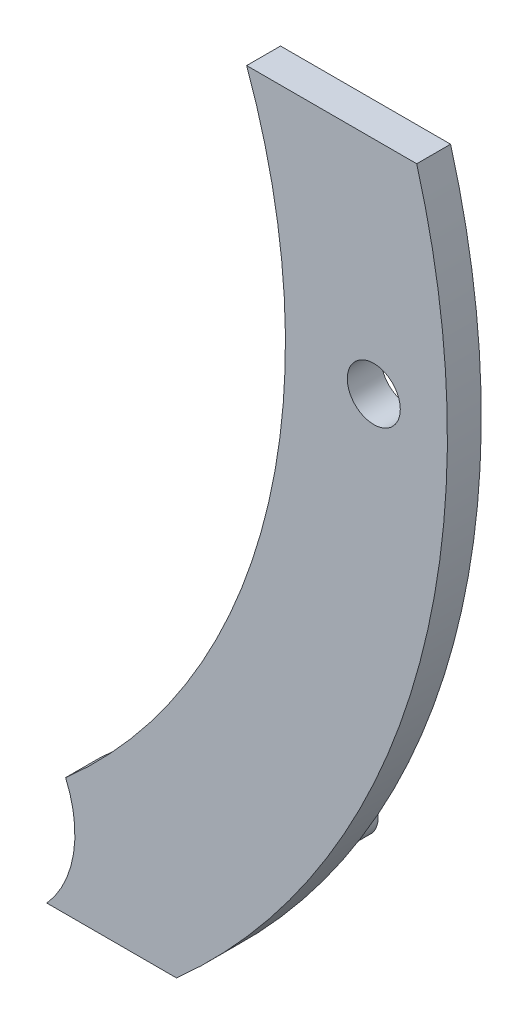
ISO-10303-21;
HEADER;
FILE_DESCRIPTION(('STEP AP214'),'2;1');
FILE_NAME('part.step','',(''),(''),'','','');
FILE_SCHEMA(('AUTOMOTIVE_DESIGN { 1 0 10303 214 1 1 1 1 }'));
ENDSEC;
DATA;
#1=APPLICATION_CONTEXT('core data for automotive mechanical design processes');
#2=APPLICATION_PROTOCOL_DEFINITION('international standard','automotive_design',2000,#1);
#3=PRODUCT_CONTEXT('',#1,'mechanical');
#4=PRODUCT('Part','Part','',(#3));
#5=PRODUCT_RELATED_PRODUCT_CATEGORY('part','',(#4));
#6=PRODUCT_DEFINITION_FORMATION('','',#4);
#7=PRODUCT_DEFINITION_CONTEXT('part definition',#1,'design');
#8=PRODUCT_DEFINITION('design','',#6,#7);
#9=PRODUCT_DEFINITION_SHAPE('','',#8);
#10=(LENGTH_UNIT() NAMED_UNIT(*) SI_UNIT(.MILLI.,.METRE.));
#11=(NAMED_UNIT(*) PLANE_ANGLE_UNIT() SI_UNIT($,.RADIAN.));
#12=(NAMED_UNIT(*) SI_UNIT($,.STERADIAN.) SOLID_ANGLE_UNIT());
#13=UNCERTAINTY_MEASURE_WITH_UNIT(LENGTH_MEASURE(1.E-05),#10,'distance_accuracy_value','');
#14=(GEOMETRIC_REPRESENTATION_CONTEXT(3) GLOBAL_UNCERTAINTY_ASSIGNED_CONTEXT((#13)) GLOBAL_UNIT_ASSIGNED_CONTEXT((#10,
#11,#12)) REPRESENTATION_CONTEXT('',''));
#15=CARTESIAN_POINT('',(0.,0.,0.));
#16=DIRECTION('',(0.,0.,1.));
#17=DIRECTION('',(1.,0.,0.));
#18=AXIS2_PLACEMENT_3D('',#15,#16,#17);
#19=CARTESIAN_POINT('',(0.,0.,3.175));
#20=DIRECTION('',(0.,0.,-1.));
#21=DIRECTION('',(-1.,0.,0.));
#22=AXIS2_PLACEMENT_3D('',#19,#20,#21);
#23=CYLINDRICAL_SURFACE('',#22,54.9999999429532);
#24=CARTESIAN_POINT('',(0.,0.,3.175));
#25=DIRECTION('',(0.,0.,1.));
#26=DIRECTION('',(1.,0.,0.));
#27=AXIS2_PLACEMENT_3D('',#24,#25,#26);
#28=CIRCLE('',#27,55.);
#29=CARTESIAN_POINT('',(36.6046103273952,-41.0499999574228,3.175));
#30=VERTEX_POINT('',#29);
#31=CARTESIAN_POINT('',(52.9150262212918,15.,3.175));
#32=VERTEX_POINT('',#31);
#33=EDGE_CURVE('E192',#30,#32,#28,.T.);
#34=ORIENTED_EDGE('',*,*,#33,.T.);
#35=DIRECTION('',(0.,0.,-1.));
#36=VECTOR('',#35,1.);
#37=CARTESIAN_POINT('',(52.9150262212918,15.,5.475));
#38=LINE('',#37,#36);
#39=CARTESIAN_POINT('',(52.9150262212918,15.,5.475));
#40=VERTEX_POINT('',#39);
#41=EDGE_CURVE('E209',#40,#32,#38,.T.);
#42=ORIENTED_EDGE('',*,*,#41,.F.);
#43=CARTESIAN_POINT('',(0.,0.,5.475));
#44=DIRECTION('',(0.,0.,1.));
#45=DIRECTION('',(1.,0.,0.));
#46=AXIS2_PLACEMENT_3D('',#43,#44,#45);
#47=CIRCLE('',#46,55.);
#48=CARTESIAN_POINT('',(36.604610365362,-41.0500000000004,5.475));
#49=VERTEX_POINT('',#48);
#50=EDGE_CURVE('E172',#49,#40,#47,.T.);
#51=ORIENTED_EDGE('',*,*,#50,.F.);
#52=DIRECTION('',(0.,0.,-1.));
#53=VECTOR('',#52,1.);
#54=CARTESIAN_POINT('',(36.604610365362,-41.0500000000004,5.475));
#55=LINE('',#54,#53);
#56=EDGE_CURVE('E213',#49,#30,#55,.T.);
#57=ORIENTED_EDGE('',*,*,#56,.T.);
#58=EDGE_LOOP('',(#34,#42,#51,#57));
#59=FACE_BOUND('',#58,.T.);
#60=ADVANCED_FACE('F41',(#59),#23,.T.);
#61=CARTESIAN_POINT('',(50.,-3.49148133884313E-13,3.175));
#62=DIRECTION('',(0.,0.,-1.));
#63=DIRECTION('',(-1.,0.,0.));
#64=AXIS2_PLACEMENT_3D('',#61,#62,#63);
#65=CYLINDRICAL_SURFACE('',#64,1.8);
#66=CARTESIAN_POINT('',(50.,-3.49148133884313E-13,3.175));
#67=DIRECTION('',(0.,0.,1.));
#68=DIRECTION('',(1.,0.,0.));
#69=AXIS2_PLACEMENT_3D('',#66,#67,#68);
#70=CIRCLE('',#69,1.8);
#71=CARTESIAN_POINT('',(51.8,-3.49148133884313E-13,3.175));
#72=VERTEX_POINT('',#71);
#73=EDGE_CURVE('E156',#72,#72,#70,.T.);
#74=ORIENTED_EDGE('',*,*,#73,.F.);
#75=EDGE_LOOP('',(#74));
#76=FACE_BOUND('',#75,.T.);
#77=CARTESIAN_POINT('',(50.,-3.49148133884313E-13,5.475));
#78=DIRECTION('',(0.,0.,1.));
#79=DIRECTION('',(1.,0.,0.));
#80=AXIS2_PLACEMENT_3D('',#77,#78,#79);
#81=CIRCLE('',#80,1.8);
#82=CARTESIAN_POINT('',(51.8,-3.49148133884313E-13,5.475));
#83=VERTEX_POINT('',#82);
#84=EDGE_CURVE('E160',#83,#83,#81,.T.);
#85=ORIENTED_EDGE('',*,*,#84,.T.);
#86=EDGE_LOOP('',(#85));
#87=FACE_BOUND('',#86,.T.);
#88=ADVANCED_FACE('F310',(#76,#87),#65,.F.);
#89=CARTESIAN_POINT('',(22.2,-36.0500000000004,5.475));
#90=DIRECTION('',(0.,0.,1.));
#91=DIRECTION('',(1.,0.,0.));
#92=AXIS2_PLACEMENT_3D('',#89,#90,#91);
#93=PLANE('',#92);
#94=CARTESIAN_POINT('',(22.2,-36.0500000000004,5.475));
#95=DIRECTION('',(0.,0.,-1.));
#96=DIRECTION('',(1.,0.,0.));
#97=AXIS2_PLACEMENT_3D('',#94,#95,#96);
#98=CIRCLE('',#97,7.50000000000001);
#99=CARTESIAN_POINT('',(29.0662473279325,-33.0326091350874,5.475));
#100=VERTEX_POINT('',#99);
#101=CARTESIAN_POINT('',(27.7901699437495,-41.0500000000004,5.475));
#102=VERTEX_POINT('',#101);
#103=EDGE_CURVE('E165',#100,#102,#98,.T.);
#104=ORIENTED_EDGE('',*,*,#103,.T.);
#105=DIRECTION('',(1.,0.,0.));
#106=VECTOR('',#105,1.);
#107=CARTESIAN_POINT('',(27.7901699437495,-41.0500000000004,5.475));
#108=LINE('',#107,#106);
#109=EDGE_CURVE('E168',#102,#49,#108,.T.);
#110=ORIENTED_EDGE('',*,*,#109,.T.);
#111=ORIENTED_EDGE('',*,*,#50,.T.);
#112=DIRECTION('',(-1.,0.,0.));
#113=VECTOR('',#112,1.);
#114=CARTESIAN_POINT('',(41.3642357598929,15.,5.475));
#115=LINE('',#114,#113);
#116=CARTESIAN_POINT('',(41.3642357598929,15.,5.475));
#117=VERTEX_POINT('',#116);
#118=EDGE_CURVE('E175',#40,#117,#115,.T.);
#119=ORIENTED_EDGE('',*,*,#118,.T.);
#120=CARTESIAN_POINT('',(0.,0.,5.475));
#121=DIRECTION('',(0.,0.,-1.));
#122=DIRECTION('',(1.,0.,0.));
#123=AXIS2_PLACEMENT_3D('',#120,#121,#122);
#124=CIRCLE('',#123,44.);
#125=EDGE_CURVE('E178',#117,#100,#124,.T.);
#126=ORIENTED_EDGE('',*,*,#125,.T.);
#127=EDGE_LOOP('',(#104,#110,#111,#119,#126));
#128=FACE_BOUND('',#127,.T.);
#129=ORIENTED_EDGE('',*,*,#84,.F.);
#130=EDGE_LOOP('',(#129));
#131=FACE_BOUND('',#130,.T.);
#132=ADVANCED_FACE('F315',(#128,#131),#93,.T.);
#133=CARTESIAN_POINT('',(22.2,-36.0500000000004,5.475));
#134=DIRECTION('',(0.,0.,-1.));
#135=DIRECTION('',(-1.,0.,0.));
#136=AXIS2_PLACEMENT_3D('',#133,#134,#135);
#137=CYLINDRICAL_SURFACE('',#136,7.50000000000001);
#138=DIRECTION('',(0.,0.,-1.));
#139=VECTOR('',#138,1.);
#140=CARTESIAN_POINT('',(29.4929760729074,-34.3000000000002,5.475));
#141=LINE('',#140,#139);
#142=CARTESIAN_POINT('',(29.4929760729074,-34.3000000000002,3.175));
#143=VERTEX_POINT('',#142);
#144=CARTESIAN_POINT('',(29.4929760729074,-34.3000000000002,-5.825));
#145=VERTEX_POINT('',#144);
#146=EDGE_CURVE('E140',#143,#145,#141,.T.);
#147=ORIENTED_EDGE('',*,*,#146,.T.);
#148=CARTESIAN_POINT('',(22.2,-36.0500000000004,-5.825));
#149=DIRECTION('',(0.,0.,-1.));
#150=DIRECTION('',(-1.,0.,0.));
#151=AXIS2_PLACEMENT_3D('',#148,#149,#150);
#152=CIRCLE('',#151,7.50000000000001);
#153=CARTESIAN_POINT('',(29.4929760729074,-37.8000000000004,-5.825));
#154=VERTEX_POINT('',#153);
#155=EDGE_CURVE('E11',#145,#154,#152,.T.);
#156=ORIENTED_EDGE('',*,*,#155,.T.);
#157=DIRECTION('',(0.,0.,-1.));
#158=VECTOR('',#157,1.);
#159=CARTESIAN_POINT('',(29.4929760729074,-37.8000000000004,5.475));
#160=LINE('',#159,#158);
#161=CARTESIAN_POINT('',(29.4929760729074,-37.8000000000004,3.175));
#162=VERTEX_POINT('',#161);
#163=EDGE_CURVE('E142',#162,#154,#160,.T.);
#164=ORIENTED_EDGE('',*,*,#163,.F.);
#165=CARTESIAN_POINT('',(22.2,-36.0500000000004,3.175));
#166=DIRECTION('',(0.,0.,-1.));
#167=DIRECTION('',(1.,0.,0.));
#168=AXIS2_PLACEMENT_3D('',#165,#166,#167);
#169=CIRCLE('',#168,7.5);
#170=CARTESIAN_POINT('',(27.7901699437495,-41.0500000000004,3.175));
#171=VERTEX_POINT('',#170);
#172=EDGE_CURVE('E184',#162,#171,#169,.T.);
#173=ORIENTED_EDGE('',*,*,#172,.T.);
#174=DIRECTION('',(0.,0.,-1.));
#175=VECTOR('',#174,1.);
#176=CARTESIAN_POINT('',(27.7901699437495,-41.0500000000004,5.475));
#177=LINE('',#176,#175);
#178=EDGE_CURVE('E217',#102,#171,#177,.T.);
#179=ORIENTED_EDGE('',*,*,#178,.F.);
#180=ORIENTED_EDGE('',*,*,#103,.F.);
#181=DIRECTION('',(0.,0.,-1.));
#182=VECTOR('',#181,1.);
#183=CARTESIAN_POINT('',(29.0662473279325,-33.0326091350874,5.475));
#184=LINE('',#183,#182);
#185=CARTESIAN_POINT('',(29.0662473279325,-33.0326091350874,3.175));
#186=VERTEX_POINT('',#185);
#187=EDGE_CURVE('E181',#100,#186,#184,.T.);
#188=ORIENTED_EDGE('',*,*,#187,.T.);
#189=CARTESIAN_POINT('',(22.2,-36.0500000000004,3.175));
#190=DIRECTION('',(0.,0.,-1.));
#191=DIRECTION('',(1.,0.,0.));
#192=AXIS2_PLACEMENT_3D('',#189,#190,#191);
#193=CIRCLE('',#192,7.50000000000001);
#194=EDGE_CURVE('E164',#186,#143,#193,.T.);
#195=ORIENTED_EDGE('',*,*,#194,.T.);
#196=EDGE_LOOP('',(#147,#156,#164,#173,#179,#180,#188,#195));
#197=FACE_BOUND('',#196,.T.);
#198=ADVANCED_FACE('F298',(#197),#137,.F.);
#199=CARTESIAN_POINT('',(27.7901699437495,-41.0500000000004,5.475));
#200=DIRECTION('',(0.,1.,0.));
#201=DIRECTION('',(0.,0.,1.));
#202=AXIS2_PLACEMENT_3D('',#199,#200,#201);
#203=PLANE('',#202);
#204=DIRECTION('',(1.,0.,0.));
#205=VECTOR('',#204,1.);
#206=CARTESIAN_POINT('',(27.7901699437495,-41.0500000000004,3.175));
#207=LINE('',#206,#205);
#208=EDGE_CURVE('E188',#171,#30,#207,.T.);
#209=ORIENTED_EDGE('',*,*,#208,.T.);
#210=ORIENTED_EDGE('',*,*,#56,.F.);
#211=ORIENTED_EDGE('',*,*,#109,.F.);
#212=ORIENTED_EDGE('',*,*,#178,.T.);
#213=EDGE_LOOP('',(#209,#210,#211,#212));
#214=FACE_BOUND('',#213,.T.);
#215=ADVANCED_FACE('F321',(#214),#203,.F.);
#216=CARTESIAN_POINT('',(41.3642357598929,15.,5.475));
#217=DIRECTION('',(0.,-1.,0.));
#218=DIRECTION('',(0.,0.,-1.));
#219=AXIS2_PLACEMENT_3D('',#216,#217,#218);
#220=PLANE('',#219);
#221=DIRECTION('',(-1.,0.,0.));
#222=VECTOR('',#221,1.);
#223=CARTESIAN_POINT('',(41.3642357598929,15.,3.175));
#224=LINE('',#223,#222);
#225=CARTESIAN_POINT('',(41.3642357598929,15.,3.175));
#226=VERTEX_POINT('',#225);
#227=EDGE_CURVE('E195',#32,#226,#224,.T.);
#228=ORIENTED_EDGE('',*,*,#227,.T.);
#229=DIRECTION('',(0.,0.,-1.));
#230=VECTOR('',#229,1.);
#231=CARTESIAN_POINT('',(41.3642357598929,15.,5.475));
#232=LINE('',#231,#230);
#233=EDGE_CURVE('E205',#117,#226,#232,.T.);
#234=ORIENTED_EDGE('',*,*,#233,.F.);
#235=ORIENTED_EDGE('',*,*,#118,.F.);
#236=ORIENTED_EDGE('',*,*,#41,.T.);
#237=EDGE_LOOP('',(#228,#234,#235,#236));
#238=FACE_BOUND('',#237,.T.);
#239=ADVANCED_FACE('F324',(#238),#220,.F.);
#240=CARTESIAN_POINT('',(0.,0.,5.475));
#241=DIRECTION('',(0.,0.,-1.));
#242=DIRECTION('',(-1.,0.,0.));
#243=AXIS2_PLACEMENT_3D('',#240,#241,#242);
#244=CYLINDRICAL_SURFACE('',#243,44.);
#245=CARTESIAN_POINT('',(0.,0.,3.175));
#246=DIRECTION('',(0.,0.,-1.));
#247=DIRECTION('',(1.,0.,0.));
#248=AXIS2_PLACEMENT_3D('',#245,#246,#247);
#249=CIRCLE('',#248,44.);
#250=EDGE_CURVE('E169',#226,#186,#249,.T.);
#251=ORIENTED_EDGE('',*,*,#250,.T.);
#252=ORIENTED_EDGE('',*,*,#187,.F.);
#253=ORIENTED_EDGE('',*,*,#125,.F.);
#254=ORIENTED_EDGE('',*,*,#233,.T.);
#255=EDGE_LOOP('',(#251,#252,#253,#254));
#256=FACE_BOUND('',#255,.T.);
#257=ADVANCED_FACE('F328',(#256),#244,.F.);
#258=CARTESIAN_POINT('',(83.2287442039231,-87.499999988792,3.175));
#259=DIRECTION('',(0.,0.,1.));
#260=DIRECTION('',(1.,0.,0.));
#261=AXIS2_PLACEMENT_3D('',#258,#259,#260);
#262=PLANE('',#261);
#263=ORIENTED_EDGE('',*,*,#73,.T.);
#264=EDGE_LOOP('',(#263));
#265=FACE_BOUND('',#264,.T.);
#266=CARTESIAN_POINT('',(37.25,-36.0500000000002,3.175));
#267=DIRECTION('',(0.,0.,1.));
#268=DIRECTION('',(1.,0.,0.));
#269=AXIS2_PLACEMENT_3D('',#266,#267,#268);
#270=CIRCLE('',#269,1.75);
#271=CARTESIAN_POINT('',(37.25,-34.3000000000002,3.175));
#272=VERTEX_POINT('',#271);
#273=CARTESIAN_POINT('',(37.25,-37.8000000000002,3.175));
#274=VERTEX_POINT('',#273);
#275=EDGE_CURVE('E128',#272,#274,#270,.F.);
#276=ORIENTED_EDGE('',*,*,#275,.F.);
#277=DIRECTION('',(1.,0.,0.));
#278=VECTOR('',#277,1.);
#279=CARTESIAN_POINT('',(21.0000000000007,-34.3000000000002,3.175));
#280=LINE('',#279,#278);
#281=EDGE_CURVE('E131',#143,#272,#280,.T.);
#282=ORIENTED_EDGE('',*,*,#281,.F.);
#283=ORIENTED_EDGE('',*,*,#194,.F.);
#284=ORIENTED_EDGE('',*,*,#250,.F.);
#285=ORIENTED_EDGE('',*,*,#227,.F.);
#286=ORIENTED_EDGE('',*,*,#33,.F.);
#287=ORIENTED_EDGE('',*,*,#208,.F.);
#288=ORIENTED_EDGE('',*,*,#172,.F.);
#289=DIRECTION('',(-1.,0.,0.));
#290=VECTOR('',#289,1.);
#291=CARTESIAN_POINT('',(21.0000000000007,-37.8000000000004,3.175));
#292=LINE('',#291,#290);
#293=EDGE_CURVE('E134',#274,#162,#292,.T.);
#294=ORIENTED_EDGE('',*,*,#293,.F.);
#295=EDGE_LOOP('',(#276,#282,#283,#284,#285,#286,#287,#288,#294));
#296=FACE_BOUND('',#295,.T.);
#297=ADVANCED_FACE('F130',(#265,#296),#262,.F.);
#298=CARTESIAN_POINT('',(29.4929760729074,-37.8000000000004,5.475));
#299=DIRECTION('',(0.,-1.,0.));
#300=DIRECTION('',(1.,0.,0.));
#301=AXIS2_PLACEMENT_3D('',#298,#299,#300);
#302=PLANE('',#301);
#303=ORIENTED_EDGE('',*,*,#163,.T.);
#304=DIRECTION('',(1.,0.,0.));
#305=VECTOR('',#304,1.);
#306=CARTESIAN_POINT('',(29.4929760729074,-37.8000000000004,-5.825));
#307=LINE('',#306,#305);
#308=CARTESIAN_POINT('',(37.25,-37.8000000000004,-5.825));
#309=VERTEX_POINT('',#308);
#310=EDGE_CURVE('E234',#154,#309,#307,.T.);
#311=ORIENTED_EDGE('',*,*,#310,.T.);
#312=DIRECTION('',(0.,0.,-1.));
#313=VECTOR('',#312,1.);
#314=CARTESIAN_POINT('',(37.25,-37.8000000000004,5.475));
#315=LINE('',#314,#313);
#316=EDGE_CURVE('E146',#274,#309,#315,.T.);
#317=ORIENTED_EDGE('',*,*,#316,.F.);
#318=ORIENTED_EDGE('',*,*,#293,.T.);
#319=EDGE_LOOP('',(#303,#311,#317,#318));
#320=FACE_BOUND('',#319,.T.);
#321=ADVANCED_FACE('F294',(#320),#302,.T.);
#322=CARTESIAN_POINT('',(37.25,-36.0500000000004,5.475));
#323=DIRECTION('',(0.,0.,-1.));
#324=DIRECTION('',(-1.,0.,0.));
#325=AXIS2_PLACEMENT_3D('',#322,#323,#324);
#326=CYLINDRICAL_SURFACE('',#325,1.75);
#327=ORIENTED_EDGE('',*,*,#316,.T.);
#328=CARTESIAN_POINT('',(37.25,-36.0500000000004,-5.825));
#329=DIRECTION('',(0.,0.,-1.));
#330=DIRECTION('',(-1.,0.,0.));
#331=AXIS2_PLACEMENT_3D('',#328,#329,#330);
#332=CIRCLE('',#331,1.75);
#333=CARTESIAN_POINT('',(37.25,-34.3000000000002,-5.825));
#334=VERTEX_POINT('',#333);
#335=EDGE_CURVE('E67',#309,#334,#332,.F.);
#336=ORIENTED_EDGE('',*,*,#335,.T.);
#337=DIRECTION('',(0.,0.,-1.));
#338=VECTOR('',#337,1.);
#339=CARTESIAN_POINT('',(37.25,-34.3000000000002,5.475));
#340=LINE('',#339,#338);
#341=EDGE_CURVE('E139',#272,#334,#340,.T.);
#342=ORIENTED_EDGE('',*,*,#341,.F.);
#343=ORIENTED_EDGE('',*,*,#275,.T.);
#344=EDGE_LOOP('',(#327,#336,#342,#343));
#345=FACE_BOUND('',#344,.T.);
#346=ADVANCED_FACE('F144',(#345),#326,.T.);
#347=CARTESIAN_POINT('',(37.25,-34.3000000000002,5.475));
#348=DIRECTION('',(0.,1.,0.));
#349=DIRECTION('',(0.,0.,1.));
#350=AXIS2_PLACEMENT_3D('',#347,#348,#349);
#351=PLANE('',#350);
#352=ORIENTED_EDGE('',*,*,#341,.T.);
#353=DIRECTION('',(-1.,0.,0.));
#354=VECTOR('',#353,1.);
#355=CARTESIAN_POINT('',(37.25,-34.3000000000002,-5.825));
#356=LINE('',#355,#354);
#357=EDGE_CURVE('E52',#334,#145,#356,.T.);
#358=ORIENTED_EDGE('',*,*,#357,.T.);
#359=ORIENTED_EDGE('',*,*,#146,.F.);
#360=ORIENTED_EDGE('',*,*,#281,.T.);
#361=EDGE_LOOP('',(#352,#358,#359,#360));
#362=FACE_BOUND('',#361,.T.);
#363=ADVANCED_FACE('F138',(#362),#351,.T.);
#364=CARTESIAN_POINT('',(22.2,-36.0500000000004,-6.325));
#365=DIRECTION('',(0.,0.,-1.));
#366=DIRECTION('',(-1.,0.,0.));
#367=AXIS2_PLACEMENT_3D('',#364,#365,#366);
#368=PLANE('',#367);
#369=CARTESIAN_POINT('',(37.25,-36.0500000000004,-6.325));
#370=DIRECTION('',(0.,0.,-1.));
#371=DIRECTION('',(-1.,0.,0.));
#372=AXIS2_PLACEMENT_3D('',#369,#370,#371);
#373=CIRCLE('',#372,1.25000000000001);
#374=CARTESIAN_POINT('',(37.25,-34.8000000000002,-6.325));
#375=VERTEX_POINT('',#374);
#376=CARTESIAN_POINT('',(37.25,-37.3000000000004,-6.325));
#377=VERTEX_POINT('',#376);
#378=EDGE_CURVE('E227',#375,#377,#373,.T.);
#379=ORIENTED_EDGE('',*,*,#378,.T.);
#380=DIRECTION('',(-1.,0.,0.));
#381=VECTOR('',#380,1.);
#382=CARTESIAN_POINT('',(22.2,-37.3000000000004,-6.325));
#383=LINE('',#382,#381);
#384=CARTESIAN_POINT('',(30.1017403146396,-37.3000000000004,-6.325));
#385=VERTEX_POINT('',#384);
#386=EDGE_CURVE('E230',#377,#385,#383,.T.);
#387=ORIENTED_EDGE('',*,*,#386,.T.);
#388=CARTESIAN_POINT('',(22.2,-36.0500000000004,-6.325));
#389=DIRECTION('',(0.,0.,-1.));
#390=DIRECTION('',(-1.,0.,0.));
#391=AXIS2_PLACEMENT_3D('',#388,#389,#390);
#392=CIRCLE('',#391,8.);
#393=CARTESIAN_POINT('',(30.1017403146395,-34.8000000000002,-6.325));
#394=VERTEX_POINT('',#393);
#395=EDGE_CURVE('E221',#385,#394,#392,.F.);
#396=ORIENTED_EDGE('',*,*,#395,.T.);
#397=DIRECTION('',(1.,0.,0.));
#398=VECTOR('',#397,1.);
#399=CARTESIAN_POINT('',(22.2,-34.8000000000002,-6.325));
#400=LINE('',#399,#398);
#401=EDGE_CURVE('E224',#394,#375,#400,.T.);
#402=ORIENTED_EDGE('',*,*,#401,.T.);
#403=EDGE_LOOP('',(#379,#387,#396,#402));
#404=FACE_BOUND('',#403,.T.);
#405=ADVANCED_FACE('F269',(#404),#368,.T.);
#406=CARTESIAN_POINT('',(22.2,-34.8000000000002,-6.325));
#407=DIRECTION('',(0.,-0.70710678118656,0.707106781186535));
#408=DIRECTION('',(1.,0.,0.));
#409=AXIS2_PLACEMENT_3D('',#406,#407,#408);
#410=PLANE('',#409);
#411=CARTESIAN_POINT('',(29.4929760729074,-34.3000000000002,-5.825));
#412=CARTESIAN_POINT('',(29.5448966522174,-34.3409359662403,-5.8659359662401));
#413=CARTESIAN_POINT('',(29.5965100686292,-34.3820664403827,-5.90706644038251));
#414=CARTESIAN_POINT('',(29.6991330164811,-34.4646952601207,-5.98969526012049));
#415=CARTESIAN_POINT('',(29.7501426066557,-34.5061935692385,-6.03119356923832));
#416=CARTESIAN_POINT('',(29.8515781149324,-34.5895446171716,-6.11454461717143));
#417=CARTESIAN_POINT('',(29.9020040377142,-34.6313973531405,-6.1563973531403));
#418=CARTESIAN_POINT('',(30.0022923936176,-34.7154461017291,-6.24044610172895));
#419=CARTESIAN_POINT('',(30.0521547709816,-34.757642147618,-6.28264214761779));
#420=CARTESIAN_POINT('',(30.1017403146396,-34.8000000000002,-6.32499999999999));
#421=B_SPLINE_CURVE_WITH_KNOTS('',3,(#411,#412,#413,#414,#415,#416,#417,#418,#419,#420),
.UNSPECIFIED.,.F.,.F.,(4,2,2,2,4),(0.,0.233290735427897,0.466558588935793,0.699824570843402,
0.933113433640569),.UNSPECIFIED.);
#422=EDGE_CURVE('E271',#145,#394,#421,.T.);
#423=ORIENTED_EDGE('',*,*,#422,.F.);
#424=ORIENTED_EDGE('',*,*,#357,.F.);
#425=DIRECTION('',(0.,0.707106781186535,0.70710678118656));
#426=VECTOR('',#425,1.);
#427=CARTESIAN_POINT('',(37.25,-34.8000000000002,-6.325));
#428=LINE('',#427,#426);
#429=EDGE_CURVE('E46',#375,#334,#428,.T.);
#430=ORIENTED_EDGE('',*,*,#429,.F.);
#431=ORIENTED_EDGE('',*,*,#401,.F.);
#432=EDGE_LOOP('',(#423,#424,#430,#431));
#433=FACE_BOUND('',#432,.T.);
#434=ADVANCED_FACE('F264',(#433),#410,.F.);
#435=CARTESIAN_POINT('',(37.25,-36.0500000000004,-6.325));
#436=DIRECTION('',(0.,0.,1.));
#437=DIRECTION('',(1.,0.,0.));
#438=AXIS2_PLACEMENT_3D('',#435,#436,#437);
#439=CONICAL_SURFACE('',#438,1.25000000000001,0.785398163397438);
#440=ORIENTED_EDGE('',*,*,#429,.T.);
#441=ORIENTED_EDGE('',*,*,#335,.F.);
#442=DIRECTION('',(0.,-0.70710678118654,0.707106781186555));
#443=VECTOR('',#442,1.);
#444=CARTESIAN_POINT('',(37.25,-37.3000000000004,-6.325));
#445=LINE('',#444,#443);
#446=EDGE_CURVE('E251',#377,#309,#445,.T.);
#447=ORIENTED_EDGE('',*,*,#446,.F.);
#448=ORIENTED_EDGE('',*,*,#378,.F.);
#449=EDGE_LOOP('',(#440,#441,#447,#448));
#450=FACE_BOUND('',#449,.T.);
#451=ADVANCED_FACE('F44',(#450),#439,.T.);
#452=CARTESIAN_POINT('',(22.2,-36.0500000000004,-6.325));
#453=DIRECTION('',(0.,0.,-1.));
#454=DIRECTION('',(-1.,0.,0.));
#455=AXIS2_PLACEMENT_3D('',#452,#453,#454);
#456=CONICAL_SURFACE('',#455,8.,0.785398163397433);
#457=ORIENTED_EDGE('',*,*,#422,.T.);
#458=ORIENTED_EDGE('',*,*,#395,.F.);
#459=CARTESIAN_POINT('',(30.1017403146396,-37.3000000000004,-6.325));
#460=CARTESIAN_POINT('',(30.0521547709817,-37.3423578523826,-6.2826421476178));
#461=CARTESIAN_POINT('',(30.0022923936176,-37.3845538982715,-6.24044610172895));
#462=CARTESIAN_POINT('',(29.9020040377143,-37.4686026468601,-6.1563973531403));
#463=CARTESIAN_POINT('',(29.8515781149324,-37.510455382829,-6.11454461717143));
#464=CARTESIAN_POINT('',(29.7501426066557,-37.5938064307621,-6.03119356923832));
#465=CARTESIAN_POINT('',(29.6991330164812,-37.6353047398799,-5.98969526012049));
#466=CARTESIAN_POINT('',(29.5965100686292,-37.7179335596179,-5.90706644038251));
#467=CARTESIAN_POINT('',(29.5448966522174,-37.7590640337603,-5.8659359662401));
#468=CARTESIAN_POINT('',(29.4929760729074,-37.8000000000004,-5.82499999999999));
#469=B_SPLINE_CURVE_WITH_KNOTS('',3,(#459,#460,#461,#462,#463,#464,#465,#466,#467,#468),
.UNSPECIFIED.,.F.,.F.,(4,2,2,2,4),(0.,0.233288862797158,0.466554844704772,0.69982269821266,
0.933113433640557),.UNSPECIFIED.);
#470=EDGE_CURVE('E242',#154,#385,#469,.F.);
#471=ORIENTED_EDGE('',*,*,#470,.F.);
#472=ORIENTED_EDGE('',*,*,#155,.F.);
#473=EDGE_LOOP('',(#457,#458,#471,#472));
#474=FACE_BOUND('',#473,.T.);
#475=ADVANCED_FACE('F253',(#474),#456,.F.);
#476=CARTESIAN_POINT('',(22.2,-37.3000000000004,-6.325));
#477=DIRECTION('',(0.,0.707106781186559,0.707106781186536));
#478=DIRECTION('',(-1.,0.,0.));
#479=AXIS2_PLACEMENT_3D('',#476,#477,#478);
#480=PLANE('',#479);
#481=ORIENTED_EDGE('',*,*,#446,.T.);
#482=ORIENTED_EDGE('',*,*,#310,.F.);
#483=ORIENTED_EDGE('',*,*,#470,.T.);
#484=ORIENTED_EDGE('',*,*,#386,.F.);
#485=EDGE_LOOP('',(#481,#482,#483,#484));
#486=FACE_BOUND('',#485,.T.);
#487=ADVANCED_FACE('F257',(#486),#480,.F.);
#488=CLOSED_SHELL('',(#60,#88,#132,#198,#215,#239,#257,#297,#321,#346,#363,#405,#434,#451,#475,#487));
#489=MANIFOLD_SOLID_BREP('B2',#488);
#490=ADVANCED_BREP_SHAPE_REPRESENTATION('',(#18,#489),#14);
#491=SHAPE_DEFINITION_REPRESENTATION(#9,#490);
ENDSEC;
END-ISO-10303-21;
